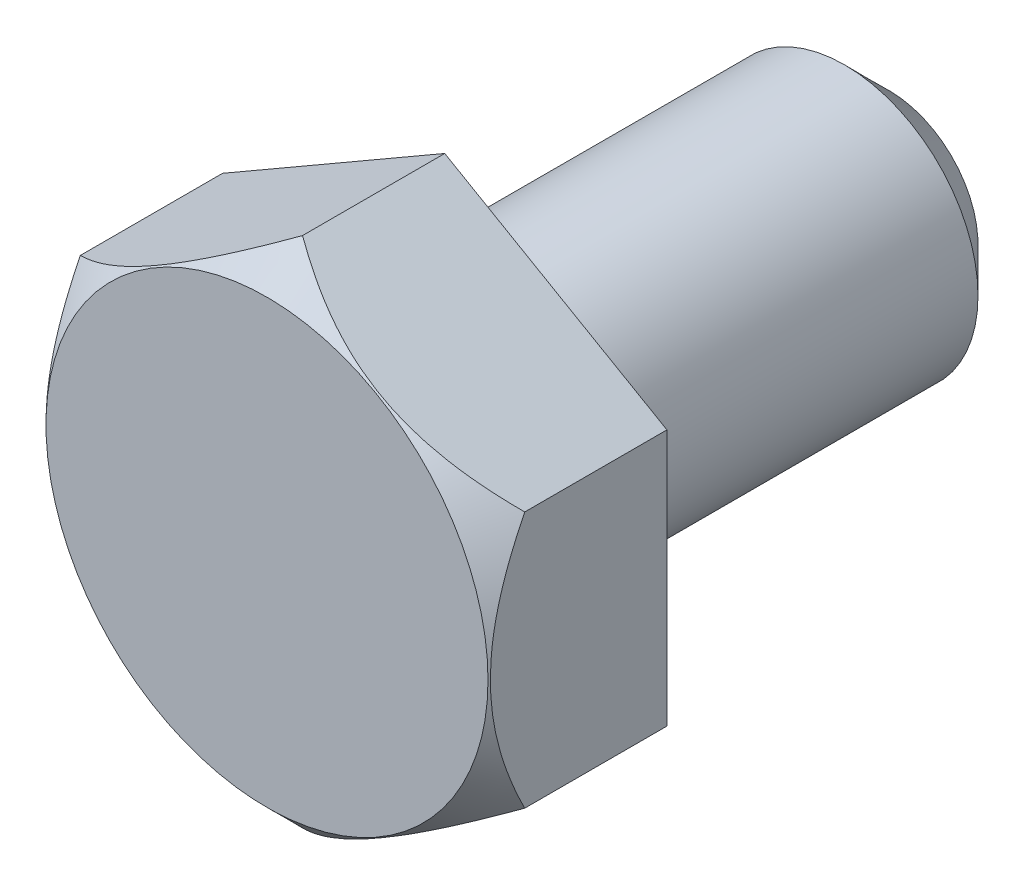
ISO-10303-21;
HEADER;
FILE_DESCRIPTION(('STEP AP214'),'2;1');
FILE_NAME('part.step','',(''),(''),'','','');
FILE_SCHEMA(('AUTOMOTIVE_DESIGN { 1 0 10303 214 1 1 1 1 }'));
ENDSEC;
DATA;
#1=APPLICATION_CONTEXT('core data for automotive mechanical design processes');
#2=APPLICATION_PROTOCOL_DEFINITION('international standard','automotive_design',2000,#1);
#3=PRODUCT_CONTEXT('',#1,'mechanical');
#4=PRODUCT('Part','Part','',(#3));
#5=PRODUCT_RELATED_PRODUCT_CATEGORY('part','',(#4));
#6=PRODUCT_DEFINITION_FORMATION('','',#4);
#7=PRODUCT_DEFINITION_CONTEXT('part definition',#1,'design');
#8=PRODUCT_DEFINITION('design','',#6,#7);
#9=PRODUCT_DEFINITION_SHAPE('','',#8);
#10=(LENGTH_UNIT() NAMED_UNIT(*) SI_UNIT(.MILLI.,.METRE.));
#11=(NAMED_UNIT(*) PLANE_ANGLE_UNIT() SI_UNIT($,.RADIAN.));
#12=(NAMED_UNIT(*) SI_UNIT($,.STERADIAN.) SOLID_ANGLE_UNIT());
#13=UNCERTAINTY_MEASURE_WITH_UNIT(LENGTH_MEASURE(1.E-05),#10,'distance_accuracy_value','');
#14=(GEOMETRIC_REPRESENTATION_CONTEXT(3) GLOBAL_UNCERTAINTY_ASSIGNED_CONTEXT((#13)) GLOBAL_UNIT_ASSIGNED_CONTEXT((#10,
#11,#12)) REPRESENTATION_CONTEXT('',''));
#15=CARTESIAN_POINT('',(0.,0.,0.));
#16=DIRECTION('',(0.,0.,1.));
#17=DIRECTION('',(1.,0.,0.));
#18=AXIS2_PLACEMENT_3D('',#15,#16,#17);
#19=CARTESIAN_POINT('',(5.,2.88675134594813,4.));
#20=DIRECTION('',(-0.5,-0.866025403784439,0.));
#21=DIRECTION('',(0.866025403784439,-0.5,0.));
#22=AXIS2_PLACEMENT_3D('',#19,#20,#21);
#23=PLANE('',#22);
#24=CARTESIAN_POINT('',(5.0002,2.88663587589429,3.19988452648213));
#25=CARTESIAN_POINT('',(4.91422723182669,2.93627227674213,3.24951645439574));
#26=CARTESIAN_POINT('',(4.82759363052819,2.98629020977269,3.2976252747131));
#27=CARTESIAN_POINT('',(4.65287511097116,3.08716399407135,3.39033336867022));
#28=CARTESIAN_POINT('',(4.56478943135639,3.13802028490869,3.43493072549851));
#29=CARTESIAN_POINT('',(4.29734143013967,3.29243146040539,3.56314092787174));
#30=CARTESIAN_POINT('',(4.11571500057817,3.39729352840467,3.64062493449848));
#31=CARTESIAN_POINT('',(3.74945075722818,3.60875628789732,3.77331105557448));
#32=CARTESIAN_POINT('',(3.56490656237539,3.71530292847296,3.82884745935416));
#33=CARTESIAN_POINT('',(3.28505622782763,3.87687459445692,3.89308950595248));
#34=CARTESIAN_POINT('',(3.19136076008721,3.9309696979787,3.91131783666136));
#35=CARTESIAN_POINT('',(3.00317647427647,4.03961794604879,3.94100781287388));
#36=CARTESIAN_POINT('',(2.90868777691895,4.09417102090353,3.95247046969491));
#37=CARTESIAN_POINT('',(2.67843374019923,4.22710825098566,3.97168913825402));
#38=CARTESIAN_POINT('',(2.54242031513758,4.3056356385584,3.97572171174029));
#39=CARTESIAN_POINT('',(2.27063858810561,4.46254889182113,3.96895414589469));
#40=CARTESIAN_POINT('',(2.13487038876419,4.54093469825829,3.958148807029));
#41=CARTESIAN_POINT('',(1.86461396792525,4.69696731557988,3.92234235010196));
#42=CARTESIAN_POINT('',(1.73012734922417,4.77461320108935,3.89732535604174));
#43=CARTESIAN_POINT('',(1.46346560060355,4.92857043343804,3.83445567501056));
#44=CARTESIAN_POINT('',(1.33129029426464,5.00488188213303,3.79660397223244));
#45=CARTESIAN_POINT('',(1.0966517934777,5.14035048372462,3.71873011323946));
#46=CARTESIAN_POINT('',(0.993669109301213,5.19980756415579,3.68075574958098));
#47=CARTESIAN_POINT('',(0.789552465807836,5.31765436322277,3.59868737382605));
#48=CARTESIAN_POINT('',(0.688418562736087,5.37604404938544,3.55459317589645));
#49=CARTESIAN_POINT('',(0.48831801176203,5.49157215635531,3.46127361464764));
#50=CARTESIAN_POINT('',(0.389345672812913,5.5487138628899,3.41206438729061));
#51=CARTESIAN_POINT('',(0.193233755386958,5.66193913120707,3.30916087715699));
#52=CARTESIAN_POINT('',(0.0960930969306183,5.7180233165161,3.25546934545098));
#53=CARTESIAN_POINT('',(-0.000200000000000491,5.7736181619501,3.19988452648213));
#54=B_SPLINE_CURVE_WITH_KNOTS('',3,(#24,#25,#26,#27,#28,#29,#30,#31,#32,#33,#34,#35,#36,#37,#38,
#39,#40,#41,#42,#43,#44,#45,#46,#47,#48,#49,#50,#51,#52,#53),.UNSPECIFIED.,.F.,.F.,(4,2,2,2,2,2,
2,2,2,2,2,2,2,2,4),(0.,0.332945616209567,0.666071736106989,1.33592065243334,1.99513262597481,
2.32409207808823,2.6530023456369,3.12358963991982,3.59434188052352,4.06562104077025,
4.53686407049609,4.91117956742315,5.28550643319669,5.65868635377114,6.03163889109472),.UNSPECIFIED.);
#55=CARTESIAN_POINT('',(5.,2.88675134594813,3.2));
#56=VERTEX_POINT('',#55);
#57=CARTESIAN_POINT('',(0.,5.77350269189626,3.2));
#58=VERTEX_POINT('',#57);
#59=EDGE_CURVE('E83',#56,#58,#54,.T.);
#60=ORIENTED_EDGE('',*,*,#59,.F.);
#61=DIRECTION('',(0.,0.,-1.));
#62=VECTOR('',#61,1.);
#63=CARTESIAN_POINT('',(5.,2.88675134594813,4.));
#64=LINE('',#63,#62);
#65=CARTESIAN_POINT('',(5.,2.88675134594813,0.));
#66=VERTEX_POINT('',#65);
#67=EDGE_CURVE('E52',#56,#66,#64,.T.);
#68=ORIENTED_EDGE('',*,*,#67,.T.);
#69=DIRECTION('',(-0.866025403784439,0.5,0.));
#70=VECTOR('',#69,1.);
#71=CARTESIAN_POINT('',(5.,2.88675134594813,0.));
#72=LINE('',#71,#70);
#73=CARTESIAN_POINT('',(0.,5.77350269189626,0.));
#74=VERTEX_POINT('',#73);
#75=EDGE_CURVE('E91',#66,#74,#72,.T.);
#76=ORIENTED_EDGE('',*,*,#75,.T.);
#77=DIRECTION('',(0.,0.,-1.));
#78=VECTOR('',#77,1.);
#79=CARTESIAN_POINT('',(0.,5.77350269189626,4.));
#80=LINE('',#79,#78);
#81=EDGE_CURVE('E90',#58,#74,#80,.T.);
#82=ORIENTED_EDGE('',*,*,#81,.F.);
#83=EDGE_LOOP('',(#60,#68,#76,#82));
#84=FACE_BOUND('',#83,.T.);
#85=ADVANCED_FACE('F29',(#84),#23,.F.);
#86=CARTESIAN_POINT('',(0.,5.77350269189626,4.));
#87=DIRECTION('',(0.5,-0.866025403784439,0.));
#88=DIRECTION('',(0.866025403784439,0.5,0.));
#89=AXIS2_PLACEMENT_3D('',#86,#87,#88);
#90=PLANE('',#89);
#91=CARTESIAN_POINT('',(0.000199999999999181,5.7736181619501,3.19988452648213));
#92=CARTESIAN_POINT('',(-0.0857727681733078,5.72398176110226,3.24951645439574));
#93=CARTESIAN_POINT('',(-0.172406369471809,5.6739638280717,3.29762527471309));
#94=CARTESIAN_POINT('',(-0.347124889028839,5.57309004377304,3.39033336867022));
#95=CARTESIAN_POINT('',(-0.435210568643609,5.5222337529357,3.43493072549851));
#96=CARTESIAN_POINT('',(-0.702658569860328,5.367822577439,3.56314092787174));
#97=CARTESIAN_POINT('',(-0.884284999421826,5.26296050943972,3.64062493449848));
#98=CARTESIAN_POINT('',(-1.25054924277182,5.05149774994706,3.77331105557448));
#99=CARTESIAN_POINT('',(-1.4350934376246,4.94495110937143,3.82884745935416));
#100=CARTESIAN_POINT('',(-1.71494377217237,4.78337944338747,3.89308950595248));
#101=CARTESIAN_POINT('',(-1.80863923991279,4.72928433986569,3.91131783666136));
#102=CARTESIAN_POINT('',(-1.99682352572353,4.6206360917956,3.94100781287388));
#103=CARTESIAN_POINT('',(-2.09131222308105,4.56608301694086,3.95247046969491));
#104=CARTESIAN_POINT('',(-2.32156625980077,4.43314578685873,3.97168913825402));
#105=CARTESIAN_POINT('',(-2.45757968486242,4.35461839928598,3.97572171174029));
#106=CARTESIAN_POINT('',(-2.72936141189439,4.19770514602326,3.96895414589469));
#107=CARTESIAN_POINT('',(-2.86512961123581,4.11931933958609,3.958148807029));
#108=CARTESIAN_POINT('',(-3.13538603207475,3.96328672226451,3.92234235010196));
#109=CARTESIAN_POINT('',(-3.26987265077583,3.88564083675504,3.89732535604174));
#110=CARTESIAN_POINT('',(-3.53653439939645,3.73168360440634,3.83445567501056));
#111=CARTESIAN_POINT('',(-3.66870970573536,3.65537215571135,3.79660397223244));
#112=CARTESIAN_POINT('',(-3.9033482065223,3.51990355411976,3.71873011323946));
#113=CARTESIAN_POINT('',(-4.00633089069879,3.4604464736886,3.68075574958098));
#114=CARTESIAN_POINT('',(-4.21044753419216,3.34259967462162,3.59868737382605));
#115=CARTESIAN_POINT('',(-4.31158143726391,3.28420998845894,3.55459317589645));
#116=CARTESIAN_POINT('',(-4.51168198823797,3.16868188148908,3.46127361464764));
#117=CARTESIAN_POINT('',(-4.61065432718709,3.11154017495448,3.41206438729061));
#118=CARTESIAN_POINT('',(-4.80676624461304,2.99831490663731,3.30916087715699));
#119=CARTESIAN_POINT('',(-4.90390690306938,2.94223072132829,3.25546934545098));
#120=CARTESIAN_POINT('',(-5.0002,2.88663587589429,3.19988452648213));
#121=B_SPLINE_CURVE_WITH_KNOTS('',3,(#91,#92,#93,#94,#95,#96,#97,#98,#99,#100,#101,#102,#103,
#104,#105,#106,#107,#108,#109,#110,#111,#112,#113,#114,#115,#116,#117,#118,#119,#120),
.UNSPECIFIED.,.F.,.F.,(4,2,2,2,2,2,2,2,2,2,2,2,2,2,4),(0.,0.332945616209567,0.666071736106989,
1.33592065243334,1.99513262597481,2.32409207808823,2.6530023456369,3.12358963991982,
3.59434188052352,4.06562104077025,4.53686407049609,4.91117956742315,5.28550643319669,
5.65868635377115,6.03163889109472),.UNSPECIFIED.);
#122=CARTESIAN_POINT('',(-5.,2.88675134594813,3.2));
#123=VERTEX_POINT('',#122);
#124=EDGE_CURVE('E92',#58,#123,#121,.T.);
#125=ORIENTED_EDGE('',*,*,#124,.F.);
#126=ORIENTED_EDGE('',*,*,#81,.T.);
#127=DIRECTION('',(-0.866025403784439,-0.5,0.));
#128=VECTOR('',#127,1.);
#129=CARTESIAN_POINT('',(0.,5.77350269189626,0.));
#130=LINE('',#129,#128);
#131=CARTESIAN_POINT('',(-5.,2.88675134594813,0.));
#132=VERTEX_POINT('',#131);
#133=EDGE_CURVE('E251',#74,#132,#130,.T.);
#134=ORIENTED_EDGE('',*,*,#133,.T.);
#135=DIRECTION('',(0.,0.,-1.));
#136=VECTOR('',#135,1.);
#137=CARTESIAN_POINT('',(-5.,2.88675134594813,4.));
#138=LINE('',#137,#136);
#139=EDGE_CURVE('E109',#123,#132,#138,.T.);
#140=ORIENTED_EDGE('',*,*,#139,.F.);
#141=EDGE_LOOP('',(#125,#126,#134,#140));
#142=FACE_BOUND('',#141,.T.);
#143=ADVANCED_FACE('F133',(#142),#90,.F.);
#144=CARTESIAN_POINT('',(-5.,2.88675134594813,4.));
#145=DIRECTION('',(1.,0.,0.));
#146=DIRECTION('',(0.,1.,0.));
#147=AXIS2_PLACEMENT_3D('',#144,#145,#146);
#148=PLANE('',#147);
#149=CARTESIAN_POINT('',(-5.,-6.01372110743531,1.15270723631676));
#150=CARTESIAN_POINT('',(-5.,-5.86839111790893,1.26443214649562));
#151=CARTESIAN_POINT('',(-5.,-5.72227684964315,1.37515293328828));
#152=CARTESIAN_POINT('',(-5.,-5.42815963057445,1.59412786932081));
#153=CARTESIAN_POINT('',(-5.,-5.28015624010267,1.70238142739101));
#154=CARTESIAN_POINT('',(-5.,-4.98085896503384,1.91673392602165));
#155=CARTESIAN_POINT('',(-5.,-4.82954850198595,2.02280979412252));
#156=CARTESIAN_POINT('',(-5.,-4.52440724195125,2.23125989065539));
#157=CARTESIAN_POINT('',(-5.,-4.37057661973037,2.33363437420224));
#158=CARTESIAN_POINT('',(-5.,-4.05016350783734,2.54016150127942));
#159=CARTESIAN_POINT('',(-5.,-3.88338924119406,2.64401810920995));
#160=CARTESIAN_POINT('',(-5.,-3.54592498157066,2.84527039639122));
#161=CARTESIAN_POINT('',(-5.,-3.3752343375683,2.94266499083032));
#162=CARTESIAN_POINT('',(-5.,-3.02989309204851,3.12891799140898));
#163=CARTESIAN_POINT('',(-5.,-2.85525611326281,3.21780145861488));
#164=CARTESIAN_POINT('',(-5.,-2.50105197736909,3.38504082922753));
#165=CARTESIAN_POINT('',(-5.,-2.32148719081471,3.46340169127758));
#166=CARTESIAN_POINT('',(-5.,-1.97489752936502,3.59973269893121));
#167=CARTESIAN_POINT('',(-5.,-1.80836763381745,3.65894841266153));
#168=CARTESIAN_POINT('',(-5.,-1.47107429296098,3.76404921123539));
#169=CARTESIAN_POINT('',(-5.,-1.30031057796578,3.80993344450886));
#170=CARTESIAN_POINT('',(-5.,-0.958538096933375,3.88512647837911));
#171=CARTESIAN_POINT('',(-5.,-0.78759654142888,3.91473564212715));
#172=CARTESIAN_POINT('',(-5.,-0.443601287189745,3.95676240575903));
#173=CARTESIAN_POINT('',(-5.,-0.270548030879701,3.96918354639178));
#174=CARTESIAN_POINT('',(-5.,0.0683944744869448,3.97578151880198));
#175=CARTESIAN_POINT('',(-5.,0.234268922862788,3.97072623815859));
#176=CARTESIAN_POINT('',(-5.,0.564718615015829,3.94441087085381));
#177=CARTESIAN_POINT('',(-5.,0.729293739050917,3.92314930787972));
#178=CARTESIAN_POINT('',(-5.,1.05874249591059,3.86526049627808));
#179=CARTESIAN_POINT('',(-5.,1.22356771816741,3.82836235973595));
#180=CARTESIAN_POINT('',(-5.,1.54959012806814,3.74124429284096));
#181=CARTESIAN_POINT('',(-5.,1.71078752518828,3.69102513381666));
#182=CARTESIAN_POINT('',(-5.,2.03864474973454,3.57617862473232));
#183=CARTESIAN_POINT('',(-5.,2.2050652246019,3.51087568682464));
#184=CARTESIAN_POINT('',(-5.,2.53362418615682,3.37018295404457));
#185=CARTESIAN_POINT('',(-5.,2.69576070002278,3.29478860564732));
#186=CARTESIAN_POINT('',(-5.,3.01651833692724,3.1357011767604));
#187=CARTESIAN_POINT('',(-5.,3.1751266699275,3.05198251773828));
#188=CARTESIAN_POINT('',(-5.,3.48870839429933,2.87808907405582));
#189=CARTESIAN_POINT('',(-5.,3.64368234111047,2.78791528457615));
#190=CARTESIAN_POINT('',(-5.,3.94289479693708,2.60695419897672));
#191=CARTESIAN_POINT('',(-5.,4.08728548129108,2.51641718972232));
#192=CARTESIAN_POINT('',(-5.,4.37358615972804,2.33149093800264));
#193=CARTESIAN_POINT('',(-5.,4.51549596660509,2.23710140660461));
#194=CARTESIAN_POINT('',(-5.,4.79601816668422,2.04592596613321));
#195=CARTESIAN_POINT('',(-5.,4.93464788988705,1.94916539490709));
#196=CARTESIAN_POINT('',(-5.,5.21000574972063,1.75305155951034));
#197=CARTESIAN_POINT('',(-5.,5.34673439999139,1.65369901736934));
#198=CARTESIAN_POINT('',(-5.,5.48266562581344,1.55328555461002));
#199=B_SPLINE_CURVE_WITH_KNOTS('',3,(#149,#150,#151,#152,#153,#154,#155,#156,#157,#158,#159,
#160,#161,#162,#163,#164,#165,#166,#167,#168,#169,#170,#171,#172,#173,#174,#175,#176,#177,#178,
#179,#180,#181,#182,#183,#184,#185,#186,#187,#188,#189,#190,#191,#192,#193,#194,#195,#196,#197,
#198),.UNSPECIFIED.,.F.,.F.,(4,2,2,2,2,2,2,2,2,2,2,2,2,2,2,2,2,2,2,2,2,2,2,2,4),(0.,
0.549945891338842,1.10002219789972,1.6543432349159,2.20862599269596,2.7979149320483,
3.38730254937942,3.97489760214765,4.56221477920244,5.09199171529938,5.62180248432615,
6.14147558607214,6.66104161872629,7.15807420770222,7.65515207931749,8.16121801902238,
8.6672546623332,9.20316641128684,9.73932079889853,10.2771767965767,10.8149500514032,
11.3261616489333,11.8374116571874,12.3445552024558,12.8515589532844),.UNSPECIFIED.);
#200=CARTESIAN_POINT('',(-5.,-2.88675134594813,3.2));
#201=VERTEX_POINT('',#200);
#202=EDGE_CURVE('E154',#123,#201,#199,.F.);
#203=ORIENTED_EDGE('',*,*,#202,.F.);
#204=ORIENTED_EDGE('',*,*,#139,.T.);
#205=DIRECTION('',(0.,-1.,0.));
#206=VECTOR('',#205,1.);
#207=CARTESIAN_POINT('',(-5.,2.88675134594813,0.));
#208=LINE('',#207,#206);
#209=CARTESIAN_POINT('',(-5.,-2.88675134594813,0.));
#210=VERTEX_POINT('',#209);
#211=EDGE_CURVE('E252',#132,#210,#208,.T.);
#212=ORIENTED_EDGE('',*,*,#211,.T.);
#213=DIRECTION('',(0.,0.,-1.));
#214=VECTOR('',#213,1.);
#215=CARTESIAN_POINT('',(-5.,-2.88675134594813,4.));
#216=LINE('',#215,#214);
#217=EDGE_CURVE('E107',#201,#210,#216,.T.);
#218=ORIENTED_EDGE('',*,*,#217,.F.);
#219=EDGE_LOOP('',(#203,#204,#212,#218));
#220=FACE_BOUND('',#219,.T.);
#221=ADVANCED_FACE('F138',(#220),#148,.F.);
#222=CARTESIAN_POINT('',(-5.,-2.88675134594813,4.));
#223=DIRECTION('',(0.5,0.866025403784439,0.));
#224=DIRECTION('',(-0.866025403784439,0.5,0.));
#225=AXIS2_PLACEMENT_3D('',#222,#223,#224);
#226=PLANE('',#225);
#227=CARTESIAN_POINT('',(-5.0002,-2.88663587589429,3.19988452648213));
#228=CARTESIAN_POINT('',(-4.91422723182669,-2.93627227674213,3.24951645439574));
#229=CARTESIAN_POINT('',(-4.82759363052819,-2.98629020977269,3.29762527471309));
#230=CARTESIAN_POINT('',(-4.65287511097116,-3.08716399407135,3.39033336867022));
#231=CARTESIAN_POINT('',(-4.56478943135639,-3.13802028490869,3.43493072549851));
#232=CARTESIAN_POINT('',(-4.29734143013967,-3.29243146040539,3.56314092787174));
#233=CARTESIAN_POINT('',(-4.11571500057817,-3.39729352840467,3.64062493449848));
#234=CARTESIAN_POINT('',(-3.74945075722818,-3.60875628789732,3.77331105557448));
#235=CARTESIAN_POINT('',(-3.5649065623754,-3.71530292847296,3.82884745935416));
#236=CARTESIAN_POINT('',(-3.28505622782763,-3.87687459445692,3.89308950595248));
#237=CARTESIAN_POINT('',(-3.19136076008721,-3.9309696979787,3.91131783666136));
#238=CARTESIAN_POINT('',(-3.00317647427647,-4.03961794604879,3.94100781287388));
#239=CARTESIAN_POINT('',(-2.90868777691895,-4.09417102090353,3.95247046969491));
#240=CARTESIAN_POINT('',(-2.67843374019923,-4.22710825098566,3.97168913825401));
#241=CARTESIAN_POINT('',(-2.54242031513758,-4.3056356385584,3.97572171174029));
#242=CARTESIAN_POINT('',(-2.27063858810561,-4.46254889182113,3.96895414589469));
#243=CARTESIAN_POINT('',(-2.13487038876419,-4.54093469825829,3.958148807029));
#244=CARTESIAN_POINT('',(-1.86461396792525,-4.69696731557988,3.92234235010196));
#245=CARTESIAN_POINT('',(-1.73012734922417,-4.77461320108935,3.89732535604174));
#246=CARTESIAN_POINT('',(-1.46346560060355,-4.92857043343804,3.83445567501056));
#247=CARTESIAN_POINT('',(-1.33129029426464,-5.00488188213303,3.79660397223244));
#248=CARTESIAN_POINT('',(-1.0966517934777,-5.14035048372462,3.71873011323946));
#249=CARTESIAN_POINT('',(-0.993669109301213,-5.19980756415579,3.68075574958098));
#250=CARTESIAN_POINT('',(-0.789552465807836,-5.31765436322277,3.59868737382605));
#251=CARTESIAN_POINT('',(-0.688418562736087,-5.37604404938544,3.55459317589645));
#252=CARTESIAN_POINT('',(-0.488318011762029,-5.49157215635531,3.46127361464764));
#253=CARTESIAN_POINT('',(-0.389345672812913,-5.54871386288991,3.41206438729061));
#254=CARTESIAN_POINT('',(-0.193233755386958,-5.66193913120707,3.30916087715699));
#255=CARTESIAN_POINT('',(-0.0960930969306183,-5.7180233165161,3.25546934545098));
#256=CARTESIAN_POINT('',(0.000200000000001157,-5.7736181619501,3.19988452648213));
#257=B_SPLINE_CURVE_WITH_KNOTS('',3,(#227,#228,#229,#230,#231,#232,#233,#234,#235,#236,#237,
#238,#239,#240,#241,#242,#243,#244,#245,#246,#247,#248,#249,#250,#251,#252,#253,#254,#255,#256),
.UNSPECIFIED.,.F.,.F.,(4,2,2,2,2,2,2,2,2,2,2,2,2,2,4),(0.,0.332945616209566,0.666071736106988,
1.33592065243334,1.99513262597481,2.32409207808823,2.6530023456369,3.12358963991982,
3.59434188052352,4.06562104077025,4.53686407049609,4.91117956742315,5.28550643319669,
5.65868635377115,6.03163889109472),.UNSPECIFIED.);
#258=CARTESIAN_POINT('',(0.,-5.77350269189626,3.2));
#259=VERTEX_POINT('',#258);
#260=EDGE_CURVE('E183',#201,#259,#257,.T.);
#261=ORIENTED_EDGE('',*,*,#260,.F.);
#262=ORIENTED_EDGE('',*,*,#217,.T.);
#263=DIRECTION('',(0.866025403784439,-0.5,0.));
#264=VECTOR('',#263,1.);
#265=CARTESIAN_POINT('',(-5.,-2.88675134594813,0.));
#266=LINE('',#265,#264);
#267=CARTESIAN_POINT('',(0.,-5.77350269189626,0.));
#268=VERTEX_POINT('',#267);
#269=EDGE_CURVE('E257',#210,#268,#266,.T.);
#270=ORIENTED_EDGE('',*,*,#269,.T.);
#271=DIRECTION('',(0.,0.,-1.));
#272=VECTOR('',#271,1.);
#273=CARTESIAN_POINT('',(0.,-5.77350269189626,4.));
#274=LINE('',#273,#272);
#275=EDGE_CURVE('E100',#259,#268,#274,.T.);
#276=ORIENTED_EDGE('',*,*,#275,.F.);
#277=EDGE_LOOP('',(#261,#262,#270,#276));
#278=FACE_BOUND('',#277,.T.);
#279=ADVANCED_FACE('F143',(#278),#226,.F.);
#280=CARTESIAN_POINT('',(0.,-5.77350269189626,4.));
#281=DIRECTION('',(-0.5,0.866025403784439,0.));
#282=DIRECTION('',(-0.866025403784439,-0.5,0.));
#283=AXIS2_PLACEMENT_3D('',#280,#281,#282);
#284=PLANE('',#283);
#285=CARTESIAN_POINT('',(-0.000199999999998817,-5.7736181619501,3.19988452648213));
#286=CARTESIAN_POINT('',(0.0857727681733079,-5.72398176110226,3.24951645439574));
#287=CARTESIAN_POINT('',(0.172406369471809,-5.6739638280717,3.29762527471309));
#288=CARTESIAN_POINT('',(0.347124889028839,-5.57309004377304,3.39033336867022));
#289=CARTESIAN_POINT('',(0.435210568643609,-5.5222337529357,3.43493072549851));
#290=CARTESIAN_POINT('',(0.702658569860328,-5.367822577439,3.56314092787174));
#291=CARTESIAN_POINT('',(0.884284999421826,-5.26296050943972,3.64062493449848));
#292=CARTESIAN_POINT('',(1.25054924277182,-5.05149774994707,3.77331105557448));
#293=CARTESIAN_POINT('',(1.4350934376246,-4.94495110937143,3.82884745935416));
#294=CARTESIAN_POINT('',(1.71494377217237,-4.78337944338747,3.89308950595248));
#295=CARTESIAN_POINT('',(1.80863923991279,-4.72928433986569,3.91131783666136));
#296=CARTESIAN_POINT('',(1.99682352572353,-4.6206360917956,3.94100781287387));
#297=CARTESIAN_POINT('',(2.09131222308105,-4.56608301694086,3.95247046969491));
#298=CARTESIAN_POINT('',(2.32156625980077,-4.43314578685873,3.97168913825402));
#299=CARTESIAN_POINT('',(2.45757968486242,-4.35461839928598,3.97572171174028));
#300=CARTESIAN_POINT('',(2.72936141189439,-4.19770514602326,3.96895414589469));
#301=CARTESIAN_POINT('',(2.86512961123581,-4.1193193395861,3.958148807029));
#302=CARTESIAN_POINT('',(3.13538603207475,-3.96328672226451,3.92234235010196));
#303=CARTESIAN_POINT('',(3.26987265077583,-3.88564083675504,3.89732535604174));
#304=CARTESIAN_POINT('',(3.53653439939645,-3.73168360440635,3.83445567501056));
#305=CARTESIAN_POINT('',(3.66870970573536,-3.65537215571136,3.79660397223244));
#306=CARTESIAN_POINT('',(3.9033482065223,-3.51990355411977,3.71873011323946));
#307=CARTESIAN_POINT('',(4.00633089069879,-3.4604464736886,3.68075574958098));
#308=CARTESIAN_POINT('',(4.21044753419216,-3.34259967462162,3.59868737382605));
#309=CARTESIAN_POINT('',(4.31158143726391,-3.28420998845895,3.55459317589645));
#310=CARTESIAN_POINT('',(4.51168198823797,-3.16868188148908,3.46127361464764));
#311=CARTESIAN_POINT('',(4.61065432718709,-3.11154017495448,3.41206438729061));
#312=CARTESIAN_POINT('',(4.80676624461304,-2.99831490663731,3.30916087715699));
#313=CARTESIAN_POINT('',(4.90390690306938,-2.94223072132829,3.25546934545098));
#314=CARTESIAN_POINT('',(5.0002,-2.88663587589429,3.19988452648213));
#315=B_SPLINE_CURVE_WITH_KNOTS('',3,(#285,#286,#287,#288,#289,#290,#291,#292,#293,#294,#295,
#296,#297,#298,#299,#300,#301,#302,#303,#304,#305,#306,#307,#308,#309,#310,#311,#312,#313,#314),
.UNSPECIFIED.,.F.,.F.,(4,2,2,2,2,2,2,2,2,2,2,2,2,2,4),(0.,0.332945616209567,0.666071736106988,
1.33592065243334,1.99513262597481,2.32409207808823,2.6530023456369,3.12358963991982,
3.59434188052352,4.06562104077025,4.53686407049609,4.91117956742316,5.28550643319669,
5.65868635377115,6.03163889109472),.UNSPECIFIED.);
#316=CARTESIAN_POINT('',(5.,-2.88675134594813,3.2));
#317=VERTEX_POINT('',#316);
#318=EDGE_CURVE('E44',#259,#317,#315,.T.);
#319=ORIENTED_EDGE('',*,*,#318,.F.);
#320=ORIENTED_EDGE('',*,*,#275,.T.);
#321=DIRECTION('',(0.866025403784439,0.5,0.));
#322=VECTOR('',#321,1.);
#323=CARTESIAN_POINT('',(0.,-5.77350269189626,0.));
#324=LINE('',#323,#322);
#325=CARTESIAN_POINT('',(5.,-2.88675134594813,0.));
#326=VERTEX_POINT('',#325);
#327=EDGE_CURVE('E102',#268,#326,#324,.T.);
#328=ORIENTED_EDGE('',*,*,#327,.T.);
#329=DIRECTION('',(0.,0.,-1.));
#330=VECTOR('',#329,1.);
#331=CARTESIAN_POINT('',(5.,-2.88675134594813,4.));
#332=LINE('',#331,#330);
#333=EDGE_CURVE('E98',#317,#326,#332,.T.);
#334=ORIENTED_EDGE('',*,*,#333,.F.);
#335=EDGE_LOOP('',(#319,#320,#328,#334));
#336=FACE_BOUND('',#335,.T.);
#337=ADVANCED_FACE('F189',(#336),#284,.F.);
#338=CARTESIAN_POINT('',(5.,-2.88675134594813,4.));
#339=DIRECTION('',(-1.,0.,0.));
#340=DIRECTION('',(0.,-1.,0.));
#341=AXIS2_PLACEMENT_3D('',#338,#339,#340);
#342=PLANE('',#341);
#343=CARTESIAN_POINT('',(5.,-6.01372110743531,1.15270723631676));
#344=CARTESIAN_POINT('',(5.,-5.86839111790893,1.26443214649562));
#345=CARTESIAN_POINT('',(5.,-5.72227684964315,1.37515293328827));
#346=CARTESIAN_POINT('',(5.,-5.42815963057445,1.59412786932081));
#347=CARTESIAN_POINT('',(5.,-5.28015624010267,1.70238142739101));
#348=CARTESIAN_POINT('',(5.,-4.98085896503384,1.91673392602165));
#349=CARTESIAN_POINT('',(5.,-4.82954850198595,2.02280979412252));
#350=CARTESIAN_POINT('',(5.,-4.52440724195125,2.23125989065539));
#351=CARTESIAN_POINT('',(5.,-4.37057661973037,2.33363437420224));
#352=CARTESIAN_POINT('',(5.,-4.05016350783734,2.54016150127942));
#353=CARTESIAN_POINT('',(5.,-3.88338924119406,2.64401810920995));
#354=CARTESIAN_POINT('',(5.,-3.54592498157066,2.84527039639122));
#355=CARTESIAN_POINT('',(5.,-3.3752343375683,2.94266499083032));
#356=CARTESIAN_POINT('',(5.,-3.02989309204851,3.12891799140898));
#357=CARTESIAN_POINT('',(5.,-2.8552561132628,3.21780145861488));
#358=CARTESIAN_POINT('',(5.,-2.50105197736909,3.38504082922753));
#359=CARTESIAN_POINT('',(5.,-2.32148719081471,3.46340169127758));
#360=CARTESIAN_POINT('',(5.,-1.97489752936502,3.59973269893121));
#361=CARTESIAN_POINT('',(5.,-1.80836763381745,3.65894841266153));
#362=CARTESIAN_POINT('',(5.,-1.47107429296097,3.76404921123539));
#363=CARTESIAN_POINT('',(5.,-1.30031057796578,3.80993344450886));
#364=CARTESIAN_POINT('',(5.,-0.958538096933373,3.88512647837911));
#365=CARTESIAN_POINT('',(5.,-0.787596541428879,3.91473564212715));
#366=CARTESIAN_POINT('',(5.,-0.443601287189743,3.95676240575903));
#367=CARTESIAN_POINT('',(5.,-0.2705480308797,3.96918354639178));
#368=CARTESIAN_POINT('',(5.,0.068394474486946,3.97578151880198));
#369=CARTESIAN_POINT('',(5.,0.234268922862789,3.97072623815859));
#370=CARTESIAN_POINT('',(5.,0.564718615015831,3.94441087085381));
#371=CARTESIAN_POINT('',(5.,0.729293739050918,3.92314930787972));
#372=CARTESIAN_POINT('',(5.,1.05874249591059,3.86526049627809));
#373=CARTESIAN_POINT('',(5.,1.22356771816741,3.82836235973595));
#374=CARTESIAN_POINT('',(5.,1.54959012806814,3.74124429284097));
#375=CARTESIAN_POINT('',(5.,1.71078752518829,3.69102513381666));
#376=CARTESIAN_POINT('',(5.,2.03864474973455,3.57617862473232));
#377=CARTESIAN_POINT('',(5.,2.20506522460191,3.51087568682464));
#378=CARTESIAN_POINT('',(5.,2.53362418615683,3.37018295404457));
#379=CARTESIAN_POINT('',(5.,2.69576070002278,3.29478860564732));
#380=CARTESIAN_POINT('',(5.,3.01651833692724,3.1357011767604));
#381=CARTESIAN_POINT('',(5.,3.17512666992751,3.05198251773828));
#382=CARTESIAN_POINT('',(5.,3.48870839429933,2.87808907405582));
#383=CARTESIAN_POINT('',(5.,3.64368234111047,2.78791528457616));
#384=CARTESIAN_POINT('',(5.,3.94289479693708,2.60695419897673));
#385=CARTESIAN_POINT('',(5.,4.08728548129108,2.51641718972232));
#386=CARTESIAN_POINT('',(5.,4.37358615972804,2.33149093800264));
#387=CARTESIAN_POINT('',(5.,4.51549596660509,2.23710140660461));
#388=CARTESIAN_POINT('',(5.,4.79601816668423,2.04592596613321));
#389=CARTESIAN_POINT('',(5.,4.93464788988705,1.94916539490709));
#390=CARTESIAN_POINT('',(5.,5.21000574972063,1.75305155951034));
#391=CARTESIAN_POINT('',(5.,5.34673439999139,1.65369901736934));
#392=CARTESIAN_POINT('',(5.,5.48266562581344,1.55328555461003));
#393=B_SPLINE_CURVE_WITH_KNOTS('',3,(#343,#344,#345,#346,#347,#348,#349,#350,#351,#352,#353,
#354,#355,#356,#357,#358,#359,#360,#361,#362,#363,#364,#365,#366,#367,#368,#369,#370,#371,#372,
#373,#374,#375,#376,#377,#378,#379,#380,#381,#382,#383,#384,#385,#386,#387,#388,#389,#390,#391,
#392),.UNSPECIFIED.,.F.,.F.,(4,2,2,2,2,2,2,2,2,2,2,2,2,2,2,2,2,2,2,2,2,2,2,2,4),(0.,
0.549945891338844,1.10002219789972,1.6543432349159,2.20862599269597,2.7979149320483,
3.38730254937942,3.97489760214765,4.56221477920245,5.09199171529938,5.62180248432615,
6.14147558607214,6.6610416187263,7.15807420770223,7.6551520793175,8.16121801902239,
8.66725466233321,9.20316641128685,9.73932079889854,10.2771767965767,10.8149500514032,
11.3261616489333,11.8374116571874,12.3445552024558,12.8515589532844),.UNSPECIFIED.);
#394=EDGE_CURVE('E81',#317,#56,#393,.T.);
#395=ORIENTED_EDGE('',*,*,#394,.F.);
#396=ORIENTED_EDGE('',*,*,#333,.T.);
#397=DIRECTION('',(0.,1.,0.));
#398=VECTOR('',#397,1.);
#399=CARTESIAN_POINT('',(5.,-2.88675134594813,0.));
#400=LINE('',#399,#398);
#401=EDGE_CURVE('E96',#326,#66,#400,.T.);
#402=ORIENTED_EDGE('',*,*,#401,.T.);
#403=ORIENTED_EDGE('',*,*,#67,.F.);
#404=EDGE_LOOP('',(#395,#396,#402,#403));
#405=FACE_BOUND('',#404,.T.);
#406=ADVANCED_FACE('F94',(#405),#342,.F.);
#407=CARTESIAN_POINT('',(-5.,8.66025403784438,0.));
#408=DIRECTION('',(0.,0.,1.));
#409=DIRECTION('',(1.,0.,0.));
#410=AXIS2_PLACEMENT_3D('',#407,#408,#409);
#411=PLANE('',#410);
#412=ORIENTED_EDGE('',*,*,#75,.F.);
#413=ORIENTED_EDGE('',*,*,#401,.F.);
#414=ORIENTED_EDGE('',*,*,#327,.F.);
#415=ORIENTED_EDGE('',*,*,#269,.F.);
#416=ORIENTED_EDGE('',*,*,#211,.F.);
#417=ORIENTED_EDGE('',*,*,#133,.F.);
#418=EDGE_LOOP('',(#412,#413,#414,#415,#416,#417));
#419=FACE_BOUND('',#418,.T.);
#420=CARTESIAN_POINT('',(0.,0.,0.));
#421=DIRECTION('',(0.,0.,1.));
#422=DIRECTION('',(1.,0.,0.));
#423=AXIS2_PLACEMENT_3D('',#420,#421,#422);
#424=CIRCLE('',#423,3.);
#425=CARTESIAN_POINT('',(3.,0.,0.));
#426=VERTEX_POINT('',#425);
#427=EDGE_CURVE('E112',#426,#426,#424,.F.);
#428=ORIENTED_EDGE('',*,*,#427,.F.);
#429=EDGE_LOOP('',(#428));
#430=FACE_BOUND('',#429,.T.);
#431=ADVANCED_FACE('F196',(#419,#430),#411,.F.);
#432=CARTESIAN_POINT('',(0.,0.,-10.));
#433=DIRECTION('',(0.,0.,1.));
#434=DIRECTION('',(1.,0.,0.));
#435=AXIS2_PLACEMENT_3D('',#432,#433,#434);
#436=CYLINDRICAL_SURFACE('',#435,3.);
#437=CARTESIAN_POINT('',(0.,0.,-9.));
#438=DIRECTION('',(0.,0.,-1.));
#439=DIRECTION('',(-1.,0.,0.));
#440=AXIS2_PLACEMENT_3D('',#437,#438,#439);
#441=CIRCLE('',#440,3.);
#442=CARTESIAN_POINT('',(-3.,0.,-9.));
#443=VERTEX_POINT('',#442);
#444=EDGE_CURVE('E11',#443,#443,#441,.F.);
#445=ORIENTED_EDGE('',*,*,#444,.T.);
#446=EDGE_LOOP('',(#445));
#447=FACE_BOUND('',#446,.T.);
#448=ORIENTED_EDGE('',*,*,#427,.T.);
#449=EDGE_LOOP('',(#448));
#450=FACE_BOUND('',#449,.T.);
#451=ADVANCED_FACE('F198',(#447,#450),#436,.T.);
#452=CARTESIAN_POINT('',(0.,0.,-10.));
#453=DIRECTION('',(0.,0.,-1.));
#454=DIRECTION('',(-1.,0.,0.));
#455=AXIS2_PLACEMENT_3D('',#452,#453,#454);
#456=PLANE('',#455);
#457=CARTESIAN_POINT('',(0.,0.,-10.));
#458=DIRECTION('',(0.,0.,-1.));
#459=DIRECTION('',(-1.,0.,0.));
#460=AXIS2_PLACEMENT_3D('',#457,#458,#459);
#461=CIRCLE('',#460,2.);
#462=CARTESIAN_POINT('',(-2.,0.,-10.));
#463=VERTEX_POINT('',#462);
#464=EDGE_CURVE('E37',#463,#463,#461,.T.);
#465=ORIENTED_EDGE('',*,*,#464,.T.);
#466=EDGE_LOOP('',(#465));
#467=FACE_BOUND('',#466,.T.);
#468=ADVANCED_FACE('F117',(#467),#456,.T.);
#469=CARTESIAN_POINT('',(0.,0.,4.));
#470=DIRECTION('',(0.,0.,-1.));
#471=DIRECTION('',(-1.,0.,0.));
#472=AXIS2_PLACEMENT_3D('',#469,#470,#471);
#473=CONICAL_SURFACE('',#472,4.97350269189626,0.785398163397449);
#474=CARTESIAN_POINT('',(0.,0.,4.));
#475=DIRECTION('',(0.,0.,1.));
#476=DIRECTION('',(1.,0.,0.));
#477=AXIS2_PLACEMENT_3D('',#474,#475,#476);
#478=CIRCLE('',#477,4.97350269189626);
#479=CARTESIAN_POINT('',(4.97350269189626,0.,4.));
#480=VERTEX_POINT('',#479);
#481=EDGE_CURVE('E87',#480,#480,#478,.T.);
#482=ORIENTED_EDGE('',*,*,#481,.F.);
#483=EDGE_LOOP('',(#482));
#484=FACE_BOUND('',#483,.T.);
#485=ORIENTED_EDGE('',*,*,#59,.T.);
#486=ORIENTED_EDGE('',*,*,#124,.T.);
#487=ORIENTED_EDGE('',*,*,#202,.T.);
#488=ORIENTED_EDGE('',*,*,#260,.T.);
#489=ORIENTED_EDGE('',*,*,#318,.T.);
#490=ORIENTED_EDGE('',*,*,#394,.T.);
#491=EDGE_LOOP('',(#485,#486,#487,#488,#489,#490));
#492=FACE_BOUND('',#491,.T.);
#493=ADVANCED_FACE('F82',(#484,#492),#473,.T.);
#494=CARTESIAN_POINT('',(-5.,8.66025403784438,4.));
#495=DIRECTION('',(0.,0.,1.));
#496=DIRECTION('',(1.,0.,0.));
#497=AXIS2_PLACEMENT_3D('',#494,#495,#496);
#498=PLANE('',#497);
#499=ORIENTED_EDGE('',*,*,#481,.T.);
#500=EDGE_LOOP('',(#499));
#501=FACE_BOUND('',#500,.T.);
#502=ADVANCED_FACE('F121',(#501),#498,.T.);
#503=CARTESIAN_POINT('',(0.,0.,-10.));
#504=DIRECTION('',(0.,0.,1.));
#505=DIRECTION('',(1.,0.,0.));
#506=AXIS2_PLACEMENT_3D('',#503,#504,#505);
#507=CONICAL_SURFACE('',#506,2.,0.785398163397447);
#508=ORIENTED_EDGE('',*,*,#444,.F.);
#509=EDGE_LOOP('',(#508));
#510=FACE_BOUND('',#509,.T.);
#511=ORIENTED_EDGE('',*,*,#464,.F.);
#512=EDGE_LOOP('',(#511));
#513=FACE_BOUND('',#512,.T.);
#514=ADVANCED_FACE('F119',(#510,#513),#507,.T.);
#515=CLOSED_SHELL('',(#85,#143,#221,#279,#337,#406,#431,#451,#468,#493,#502,#514));
#516=MANIFOLD_SOLID_BREP('B2',#515);
#517=ADVANCED_BREP_SHAPE_REPRESENTATION('',(#18,#516),#14);
#518=SHAPE_DEFINITION_REPRESENTATION(#9,#517);
ENDSEC;
END-ISO-10303-21;
